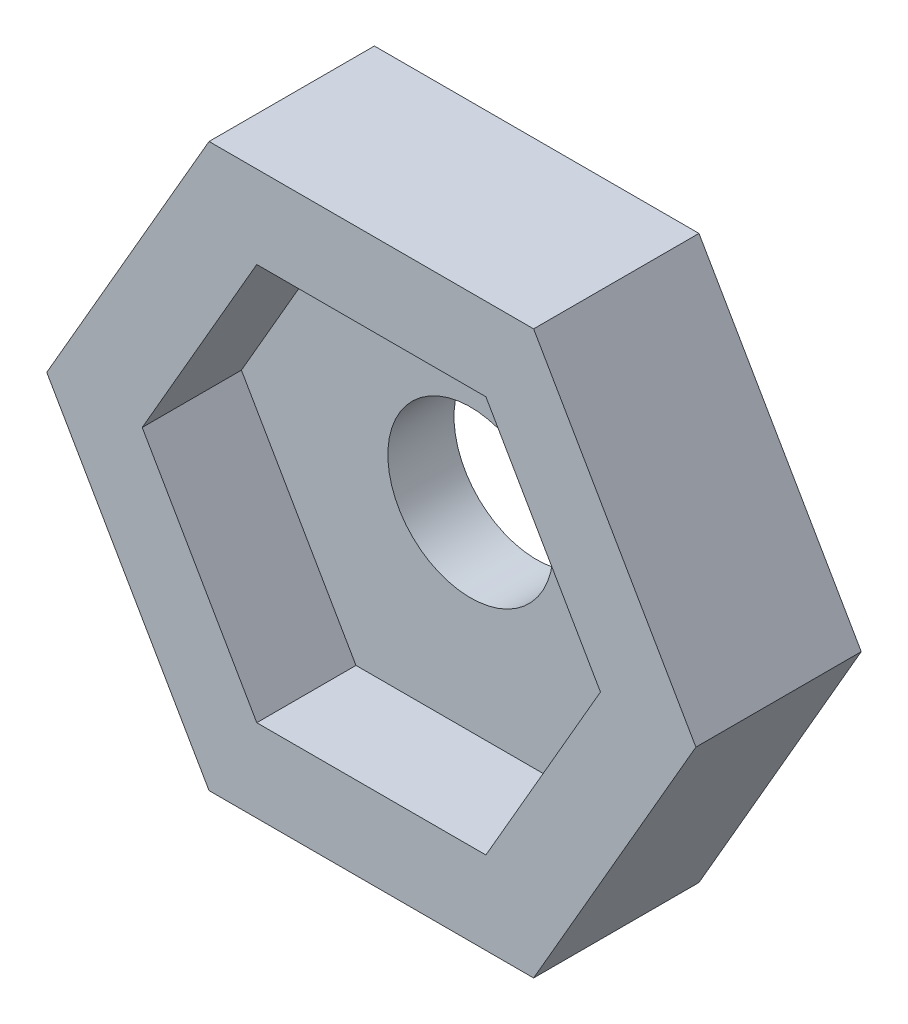
ISO-10303-21;
HEADER;
FILE_DESCRIPTION(('STEP AP214'),'2;1');
FILE_NAME('part.step','',(''),(''),'','','');
FILE_SCHEMA(('AUTOMOTIVE_DESIGN { 1 0 10303 214 1 1 1 1 }'));
ENDSEC;
DATA;
#1=APPLICATION_CONTEXT('core data for automotive mechanical design processes');
#2=APPLICATION_PROTOCOL_DEFINITION('international standard','automotive_design',2000,#1);
#3=PRODUCT_CONTEXT('',#1,'mechanical');
#4=PRODUCT('Part','Part','',(#3));
#5=PRODUCT_RELATED_PRODUCT_CATEGORY('part','',(#4));
#6=PRODUCT_DEFINITION_FORMATION('','',#4);
#7=PRODUCT_DEFINITION_CONTEXT('part definition',#1,'design');
#8=PRODUCT_DEFINITION('design','',#6,#7);
#9=PRODUCT_DEFINITION_SHAPE('','',#8);
#10=(LENGTH_UNIT() NAMED_UNIT(*) SI_UNIT(.MILLI.,.METRE.));
#11=(NAMED_UNIT(*) PLANE_ANGLE_UNIT() SI_UNIT($,.RADIAN.));
#12=(NAMED_UNIT(*) SI_UNIT($,.STERADIAN.) SOLID_ANGLE_UNIT());
#13=UNCERTAINTY_MEASURE_WITH_UNIT(LENGTH_MEASURE(1.E-05),#10,'distance_accuracy_value','');
#14=(GEOMETRIC_REPRESENTATION_CONTEXT(3) GLOBAL_UNCERTAINTY_ASSIGNED_CONTEXT((#13)) GLOBAL_UNIT_ASSIGNED_CONTEXT((#10,
#11,#12)) REPRESENTATION_CONTEXT('',''));
#15=CARTESIAN_POINT('',(0.,0.,0.));
#16=DIRECTION('',(0.,0.,1.));
#17=DIRECTION('',(1.,0.,0.));
#18=AXIS2_PLACEMENT_3D('',#15,#16,#17);
#19=CARTESIAN_POINT('',(0.,0.,5.));
#20=DIRECTION('',(0.,0.,-1.));
#21=DIRECTION('',(-1.,0.,0.));
#22=AXIS2_PLACEMENT_3D('',#19,#20,#21);
#23=CYLINDRICAL_SURFACE('',#22,2.5);
#24=CARTESIAN_POINT('',(0.,0.,0.));
#25=DIRECTION('',(0.,0.,1.));
#26=DIRECTION('',(1.,0.,0.));
#27=AXIS2_PLACEMENT_3D('',#24,#25,#26);
#28=CIRCLE('',#27,2.5);
#29=CARTESIAN_POINT('',(2.5,0.,0.));
#30=VERTEX_POINT('',#29);
#31=EDGE_CURVE('E141',#30,#30,#28,.T.);
#32=ORIENTED_EDGE('',*,*,#31,.F.);
#33=EDGE_LOOP('',(#32));
#34=FACE_BOUND('',#33,.T.);
#35=CARTESIAN_POINT('',(0.,0.,2.));
#36=DIRECTION('',(0.,0.,1.));
#37=DIRECTION('',(1.,0.,0.));
#38=AXIS2_PLACEMENT_3D('',#35,#36,#37);
#39=CIRCLE('',#38,2.5);
#40=CARTESIAN_POINT('',(2.5,0.,2.));
#41=VERTEX_POINT('',#40);
#42=EDGE_CURVE('E42',#41,#41,#39,.T.);
#43=ORIENTED_EDGE('',*,*,#42,.T.);
#44=EDGE_LOOP('',(#43));
#45=FACE_BOUND('',#44,.T.);
#46=ADVANCED_FACE('F39',(#34,#45),#23,.F.);
#47=CARTESIAN_POINT('',(-7.36121593216774,-4.25,5.));
#48=DIRECTION('',(0.866025403784439,0.5,0.));
#49=DIRECTION('',(-0.5,0.866025403784439,0.));
#50=AXIS2_PLACEMENT_3D('',#47,#48,#49);
#51=PLANE('',#50);
#52=DIRECTION('',(0.5,-0.866025403784439,0.));
#53=VECTOR('',#52,1.);
#54=CARTESIAN_POINT('',(-7.36121593216774,-4.25,0.));
#55=LINE('',#54,#53);
#56=CARTESIAN_POINT('',(-9.81495457622365,0.,0.));
#57=VERTEX_POINT('',#56);
#58=CARTESIAN_POINT('',(-4.90747728811183,-8.50000000000001,0.));
#59=VERTEX_POINT('',#58);
#60=EDGE_CURVE('E145',#57,#59,#55,.T.);
#61=ORIENTED_EDGE('',*,*,#60,.T.);
#62=DIRECTION('',(0.,0.,-1.));
#63=VECTOR('',#62,1.);
#64=CARTESIAN_POINT('',(-4.90747728811183,-8.50000000000001,5.));
#65=LINE('',#64,#63);
#66=CARTESIAN_POINT('',(-4.90747728811183,-8.50000000000001,5.));
#67=VERTEX_POINT('',#66);
#68=EDGE_CURVE('E11',#67,#59,#65,.T.);
#69=ORIENTED_EDGE('',*,*,#68,.F.);
#70=DIRECTION('',(0.5,-0.866025403784439,0.));
#71=VECTOR('',#70,1.);
#72=CARTESIAN_POINT('',(-7.36121593216774,-4.25,5.));
#73=LINE('',#72,#71);
#74=CARTESIAN_POINT('',(-9.81495457622365,0.,5.));
#75=VERTEX_POINT('',#74);
#76=EDGE_CURVE('E162',#75,#67,#73,.T.);
#77=ORIENTED_EDGE('',*,*,#76,.F.);
#78=DIRECTION('',(0.,0.,-1.));
#79=VECTOR('',#78,1.);
#80=CARTESIAN_POINT('',(-9.81495457622365,0.,5.));
#81=LINE('',#80,#79);
#82=EDGE_CURVE('E137',#75,#57,#81,.T.);
#83=ORIENTED_EDGE('',*,*,#82,.T.);
#84=EDGE_LOOP('',(#61,#69,#77,#83));
#85=FACE_BOUND('',#84,.T.);
#86=ADVANCED_FACE('F181',(#85),#51,.F.);
#87=CARTESIAN_POINT('',(0.,-8.50000000000001,5.));
#88=DIRECTION('',(0.,1.,0.));
#89=DIRECTION('',(-1.,0.,0.));
#90=AXIS2_PLACEMENT_3D('',#87,#88,#89);
#91=PLANE('',#90);
#92=DIRECTION('',(1.,0.,0.));
#93=VECTOR('',#92,1.);
#94=CARTESIAN_POINT('',(0.,-8.50000000000001,0.));
#95=LINE('',#94,#93);
#96=CARTESIAN_POINT('',(4.90747728811182,-8.50000000000001,0.));
#97=VERTEX_POINT('',#96);
#98=EDGE_CURVE('E149',#59,#97,#95,.T.);
#99=ORIENTED_EDGE('',*,*,#98,.T.);
#100=DIRECTION('',(0.,0.,-1.));
#101=VECTOR('',#100,1.);
#102=CARTESIAN_POINT('',(4.90747728811182,-8.50000000000001,5.));
#103=LINE('',#102,#101);
#104=CARTESIAN_POINT('',(4.90747728811182,-8.50000000000001,5.));
#105=VERTEX_POINT('',#104);
#106=EDGE_CURVE('E48',#105,#97,#103,.T.);
#107=ORIENTED_EDGE('',*,*,#106,.F.);
#108=DIRECTION('',(1.,0.,0.));
#109=VECTOR('',#108,1.);
#110=CARTESIAN_POINT('',(0.,-8.50000000000001,5.));
#111=LINE('',#110,#109);
#112=EDGE_CURVE('E99',#67,#105,#111,.T.);
#113=ORIENTED_EDGE('',*,*,#112,.F.);
#114=ORIENTED_EDGE('',*,*,#68,.T.);
#115=EDGE_LOOP('',(#99,#107,#113,#114));
#116=FACE_BOUND('',#115,.T.);
#117=ADVANCED_FACE('F316',(#116),#91,.F.);
#118=CARTESIAN_POINT('',(7.36121593216773,-4.25000000000001,5.));
#119=DIRECTION('',(-0.866025403784438,0.500000000000001,0.));
#120=DIRECTION('',(-0.500000000000001,-0.866025403784438,0.));
#121=AXIS2_PLACEMENT_3D('',#118,#119,#120);
#122=PLANE('',#121);
#123=DIRECTION('',(0.500000000000001,0.866025403784438,0.));
#124=VECTOR('',#123,1.);
#125=CARTESIAN_POINT('',(7.36121593216773,-4.25000000000001,0.));
#126=LINE('',#125,#124);
#127=CARTESIAN_POINT('',(9.81495457622365,0.,0.));
#128=VERTEX_POINT('',#127);
#129=EDGE_CURVE('E152',#97,#128,#126,.T.);
#130=ORIENTED_EDGE('',*,*,#129,.T.);
#131=DIRECTION('',(0.,0.,-1.));
#132=VECTOR('',#131,1.);
#133=CARTESIAN_POINT('',(9.81495457622365,0.,5.));
#134=LINE('',#133,#132);
#135=CARTESIAN_POINT('',(9.81495457622365,0.,5.));
#136=VERTEX_POINT('',#135);
#137=EDGE_CURVE('E130',#136,#128,#134,.T.);
#138=ORIENTED_EDGE('',*,*,#137,.F.);
#139=DIRECTION('',(0.500000000000001,0.866025403784438,0.));
#140=VECTOR('',#139,1.);
#141=CARTESIAN_POINT('',(7.36121593216773,-4.25000000000001,5.));
#142=LINE('',#141,#140);
#143=EDGE_CURVE('E116',#105,#136,#142,.T.);
#144=ORIENTED_EDGE('',*,*,#143,.F.);
#145=ORIENTED_EDGE('',*,*,#106,.T.);
#146=EDGE_LOOP('',(#130,#138,#144,#145));
#147=FACE_BOUND('',#146,.T.);
#148=ADVANCED_FACE('F173',(#147),#122,.F.);
#149=CARTESIAN_POINT('',(7.36121593216774,4.25,5.));
#150=DIRECTION('',(-0.866025403784439,-0.5,0.));
#151=DIRECTION('',(0.5,-0.866025403784439,0.));
#152=AXIS2_PLACEMENT_3D('',#149,#150,#151);
#153=PLANE('',#152);
#154=DIRECTION('',(-0.5,0.866025403784439,0.));
#155=VECTOR('',#154,1.);
#156=CARTESIAN_POINT('',(7.36121593216774,4.25,0.));
#157=LINE('',#156,#155);
#158=CARTESIAN_POINT('',(4.90747728811183,8.5,0.));
#159=VERTEX_POINT('',#158);
#160=EDGE_CURVE('E126',#128,#159,#157,.T.);
#161=ORIENTED_EDGE('',*,*,#160,.T.);
#162=DIRECTION('',(0.,0.,-1.));
#163=VECTOR('',#162,1.);
#164=CARTESIAN_POINT('',(4.90747728811183,8.5,5.));
#165=LINE('',#164,#163);
#166=CARTESIAN_POINT('',(4.90747728811183,8.5,5.));
#167=VERTEX_POINT('',#166);
#168=EDGE_CURVE('E123',#167,#159,#165,.T.);
#169=ORIENTED_EDGE('',*,*,#168,.F.);
#170=DIRECTION('',(-0.5,0.866025403784439,0.));
#171=VECTOR('',#170,1.);
#172=CARTESIAN_POINT('',(7.36121593216774,4.25,5.));
#173=LINE('',#172,#171);
#174=EDGE_CURVE('E109',#136,#167,#173,.T.);
#175=ORIENTED_EDGE('',*,*,#174,.F.);
#176=ORIENTED_EDGE('',*,*,#137,.T.);
#177=EDGE_LOOP('',(#161,#169,#175,#176));
#178=FACE_BOUND('',#177,.T.);
#179=ADVANCED_FACE('F124',(#178),#153,.F.);
#180=CARTESIAN_POINT('',(0.,8.50000000000001,5.));
#181=DIRECTION('',(0.,-1.,0.));
#182=DIRECTION('',(1.,0.,0.));
#183=AXIS2_PLACEMENT_3D('',#180,#181,#182);
#184=PLANE('',#183);
#185=DIRECTION('',(-1.,0.,0.));
#186=VECTOR('',#185,1.);
#187=CARTESIAN_POINT('',(0.,8.50000000000001,0.));
#188=LINE('',#187,#186);
#189=CARTESIAN_POINT('',(-4.90747728811182,8.50000000000001,0.));
#190=VERTEX_POINT('',#189);
#191=EDGE_CURVE('E157',#159,#190,#188,.T.);
#192=ORIENTED_EDGE('',*,*,#191,.T.);
#193=DIRECTION('',(0.,0.,-1.));
#194=VECTOR('',#193,1.);
#195=CARTESIAN_POINT('',(-4.90747728811182,8.50000000000001,5.));
#196=LINE('',#195,#194);
#197=CARTESIAN_POINT('',(-4.90747728811182,8.50000000000001,5.));
#198=VERTEX_POINT('',#197);
#199=EDGE_CURVE('E131',#198,#190,#196,.T.);
#200=ORIENTED_EDGE('',*,*,#199,.F.);
#201=DIRECTION('',(-1.,0.,0.));
#202=VECTOR('',#201,1.);
#203=CARTESIAN_POINT('',(0.,8.50000000000001,5.));
#204=LINE('',#203,#202);
#205=EDGE_CURVE('E113',#167,#198,#204,.T.);
#206=ORIENTED_EDGE('',*,*,#205,.F.);
#207=ORIENTED_EDGE('',*,*,#168,.T.);
#208=EDGE_LOOP('',(#192,#200,#206,#207));
#209=FACE_BOUND('',#208,.T.);
#210=ADVANCED_FACE('F133',(#209),#184,.F.);
#211=CARTESIAN_POINT('',(-7.36121593216773,4.25000000000001,5.));
#212=DIRECTION('',(0.866025403784438,-0.5,0.));
#213=DIRECTION('',(0.5,0.866025403784438,0.));
#214=AXIS2_PLACEMENT_3D('',#211,#212,#213);
#215=PLANE('',#214);
#216=DIRECTION('',(-0.5,-0.866025403784438,0.));
#217=VECTOR('',#216,1.);
#218=CARTESIAN_POINT('',(-7.36121593216773,4.25000000000001,0.));
#219=LINE('',#218,#217);
#220=EDGE_CURVE('E91',#190,#57,#219,.T.);
#221=ORIENTED_EDGE('',*,*,#220,.T.);
#222=ORIENTED_EDGE('',*,*,#82,.F.);
#223=DIRECTION('',(-0.5,-0.866025403784438,0.));
#224=VECTOR('',#223,1.);
#225=CARTESIAN_POINT('',(-7.36121593216773,4.25000000000001,5.));
#226=LINE('',#225,#224);
#227=EDGE_CURVE('E64',#198,#75,#226,.T.);
#228=ORIENTED_EDGE('',*,*,#227,.F.);
#229=ORIENTED_EDGE('',*,*,#199,.T.);
#230=EDGE_LOOP('',(#221,#222,#228,#229));
#231=FACE_BOUND('',#230,.T.);
#232=ADVANCED_FACE('F177',(#231),#215,.F.);
#233=CARTESIAN_POINT('',(0.,0.,5.));
#234=DIRECTION('',(0.,0.,1.));
#235=DIRECTION('',(1.,0.,0.));
#236=AXIS2_PLACEMENT_3D('',#233,#234,#235);
#237=PLANE('',#236);
#238=DIRECTION('',(1.,0.,0.));
#239=VECTOR('',#238,1.);
#240=CARTESIAN_POINT('',(-3.46410161513775,-6.,5.));
#241=LINE('',#240,#239);
#242=CARTESIAN_POINT('',(-3.46410161513775,-6.,5.));
#243=VERTEX_POINT('',#242);
#244=CARTESIAN_POINT('',(3.46410161513776,-6.,5.));
#245=VERTEX_POINT('',#244);
#246=EDGE_CURVE('E55',#243,#245,#241,.T.);
#247=ORIENTED_EDGE('',*,*,#246,.F.);
#248=DIRECTION('',(0.5,-0.866025403784438,0.));
#249=VECTOR('',#248,1.);
#250=CARTESIAN_POINT('',(-6.92820323027551,0.,5.));
#251=LINE('',#250,#249);
#252=CARTESIAN_POINT('',(-6.92820323027551,0.,5.));
#253=VERTEX_POINT('',#252);
#254=EDGE_CURVE('E211',#253,#243,#251,.T.);
#255=ORIENTED_EDGE('',*,*,#254,.F.);
#256=DIRECTION('',(-0.5,-0.866025403784439,0.));
#257=VECTOR('',#256,1.);
#258=CARTESIAN_POINT('',(-3.46410161513776,6.,5.));
#259=LINE('',#258,#257);
#260=CARTESIAN_POINT('',(-3.46410161513776,6.,5.));
#261=VERTEX_POINT('',#260);
#262=EDGE_CURVE('E216',#261,#253,#259,.T.);
#263=ORIENTED_EDGE('',*,*,#262,.F.);
#264=DIRECTION('',(-1.,0.,0.));
#265=VECTOR('',#264,1.);
#266=CARTESIAN_POINT('',(3.46410161513776,6.,5.));
#267=LINE('',#266,#265);
#268=CARTESIAN_POINT('',(3.46410161513776,6.,5.));
#269=VERTEX_POINT('',#268);
#270=EDGE_CURVE('E220',#269,#261,#267,.T.);
#271=ORIENTED_EDGE('',*,*,#270,.F.);
#272=DIRECTION('',(-0.500000000000001,0.866025403784438,0.));
#273=VECTOR('',#272,1.);
#274=CARTESIAN_POINT('',(6.92820323027551,0.,5.));
#275=LINE('',#274,#273);
#276=CARTESIAN_POINT('',(6.92820323027551,0.,5.));
#277=VERTEX_POINT('',#276);
#278=EDGE_CURVE('E224',#277,#269,#275,.T.);
#279=ORIENTED_EDGE('',*,*,#278,.F.);
#280=DIRECTION('',(0.5,0.866025403784439,0.));
#281=VECTOR('',#280,1.);
#282=CARTESIAN_POINT('',(3.46410161513776,-6.,5.));
#283=LINE('',#282,#281);
#284=EDGE_CURVE('E228',#245,#277,#283,.T.);
#285=ORIENTED_EDGE('',*,*,#284,.F.);
#286=EDGE_LOOP('',(#247,#255,#263,#271,#279,#285));
#287=FACE_BOUND('',#286,.T.);
#288=ORIENTED_EDGE('',*,*,#76,.T.);
#289=ORIENTED_EDGE('',*,*,#112,.T.);
#290=ORIENTED_EDGE('',*,*,#143,.T.);
#291=ORIENTED_EDGE('',*,*,#174,.T.);
#292=ORIENTED_EDGE('',*,*,#205,.T.);
#293=ORIENTED_EDGE('',*,*,#227,.T.);
#294=EDGE_LOOP('',(#288,#289,#290,#291,#292,#293));
#295=FACE_BOUND('',#294,.T.);
#296=ADVANCED_FACE('F111',(#287,#295),#237,.T.);
#297=CARTESIAN_POINT('',(0.,0.,0.));
#298=DIRECTION('',(0.,0.,1.));
#299=DIRECTION('',(1.,0.,0.));
#300=AXIS2_PLACEMENT_3D('',#297,#298,#299);
#301=PLANE('',#300);
#302=ORIENTED_EDGE('',*,*,#31,.T.);
#303=EDGE_LOOP('',(#302));
#304=FACE_BOUND('',#303,.T.);
#305=ORIENTED_EDGE('',*,*,#60,.F.);
#306=ORIENTED_EDGE('',*,*,#220,.F.);
#307=ORIENTED_EDGE('',*,*,#191,.F.);
#308=ORIENTED_EDGE('',*,*,#160,.F.);
#309=ORIENTED_EDGE('',*,*,#129,.F.);
#310=ORIENTED_EDGE('',*,*,#98,.F.);
#311=EDGE_LOOP('',(#305,#306,#307,#308,#309,#310));
#312=FACE_BOUND('',#311,.T.);
#313=ADVANCED_FACE('F176',(#304,#312),#301,.F.);
#314=CARTESIAN_POINT('',(-3.46410161513775,-6.,2.));
#315=DIRECTION('',(0.,-1.,0.));
#316=DIRECTION('',(1.,0.,0.));
#317=AXIS2_PLACEMENT_3D('',#314,#315,#316);
#318=PLANE('',#317);
#319=ORIENTED_EDGE('',*,*,#246,.T.);
#320=DIRECTION('',(0.,0.,1.));
#321=VECTOR('',#320,1.);
#322=CARTESIAN_POINT('',(3.46410161513776,-6.,2.));
#323=LINE('',#322,#321);
#324=CARTESIAN_POINT('',(3.46410161513776,-6.,2.));
#325=VERTEX_POINT('',#324);
#326=EDGE_CURVE('E187',#325,#245,#323,.T.);
#327=ORIENTED_EDGE('',*,*,#326,.F.);
#328=DIRECTION('',(1.,0.,0.));
#329=VECTOR('',#328,1.);
#330=CARTESIAN_POINT('',(-3.46410161513775,-6.,2.));
#331=LINE('',#330,#329);
#332=CARTESIAN_POINT('',(-3.46410161513775,-6.,2.));
#333=VERTEX_POINT('',#332);
#334=EDGE_CURVE('E215',#333,#325,#331,.T.);
#335=ORIENTED_EDGE('',*,*,#334,.F.);
#336=DIRECTION('',(0.,0.,1.));
#337=VECTOR('',#336,1.);
#338=CARTESIAN_POINT('',(-3.46410161513775,-6.,2.));
#339=LINE('',#338,#337);
#340=EDGE_CURVE('E208',#333,#243,#339,.T.);
#341=ORIENTED_EDGE('',*,*,#340,.T.);
#342=EDGE_LOOP('',(#319,#327,#335,#341));
#343=FACE_BOUND('',#342,.T.);
#344=ADVANCED_FACE('F263',(#343),#318,.F.);
#345=CARTESIAN_POINT('',(-6.92820323027551,0.,2.));
#346=DIRECTION('',(-0.866025403784439,-0.5,0.));
#347=DIRECTION('',(0.5,-0.866025403784439,0.));
#348=AXIS2_PLACEMENT_3D('',#345,#346,#347);
#349=PLANE('',#348);
#350=ORIENTED_EDGE('',*,*,#254,.T.);
#351=ORIENTED_EDGE('',*,*,#340,.F.);
#352=DIRECTION('',(0.5,-0.866025403784438,0.));
#353=VECTOR('',#352,1.);
#354=CARTESIAN_POINT('',(-6.92820323027551,0.,2.));
#355=LINE('',#354,#353);
#356=CARTESIAN_POINT('',(-6.92820323027551,0.,2.));
#357=VERTEX_POINT('',#356);
#358=EDGE_CURVE('E192',#357,#333,#355,.T.);
#359=ORIENTED_EDGE('',*,*,#358,.F.);
#360=DIRECTION('',(0.,0.,1.));
#361=VECTOR('',#360,1.);
#362=CARTESIAN_POINT('',(-6.92820323027551,0.,2.));
#363=LINE('',#362,#361);
#364=EDGE_CURVE('E204',#357,#253,#363,.T.);
#365=ORIENTED_EDGE('',*,*,#364,.T.);
#366=EDGE_LOOP('',(#350,#351,#359,#365));
#367=FACE_BOUND('',#366,.T.);
#368=ADVANCED_FACE('F279',(#367),#349,.F.);
#369=CARTESIAN_POINT('',(-3.46410161513776,6.,2.));
#370=DIRECTION('',(-0.866025403784438,0.5,0.));
#371=DIRECTION('',(-0.5,-0.866025403784439,0.));
#372=AXIS2_PLACEMENT_3D('',#369,#370,#371);
#373=PLANE('',#372);
#374=ORIENTED_EDGE('',*,*,#262,.T.);
#375=ORIENTED_EDGE('',*,*,#364,.F.);
#376=DIRECTION('',(-0.5,-0.866025403784439,0.));
#377=VECTOR('',#376,1.);
#378=CARTESIAN_POINT('',(-3.46410161513776,6.,2.));
#379=LINE('',#378,#377);
#380=CARTESIAN_POINT('',(-3.46410161513776,6.,2.));
#381=VERTEX_POINT('',#380);
#382=EDGE_CURVE('E237',#381,#357,#379,.T.);
#383=ORIENTED_EDGE('',*,*,#382,.F.);
#384=DIRECTION('',(0.,0.,1.));
#385=VECTOR('',#384,1.);
#386=CARTESIAN_POINT('',(-3.46410161513776,6.,2.));
#387=LINE('',#386,#385);
#388=EDGE_CURVE('E200',#381,#261,#387,.T.);
#389=ORIENTED_EDGE('',*,*,#388,.T.);
#390=EDGE_LOOP('',(#374,#375,#383,#389));
#391=FACE_BOUND('',#390,.T.);
#392=ADVANCED_FACE('F284',(#391),#373,.F.);
#393=CARTESIAN_POINT('',(3.46410161513776,6.,2.));
#394=DIRECTION('',(0.,1.,0.));
#395=DIRECTION('',(-1.,0.,0.));
#396=AXIS2_PLACEMENT_3D('',#393,#394,#395);
#397=PLANE('',#396);
#398=ORIENTED_EDGE('',*,*,#270,.T.);
#399=ORIENTED_EDGE('',*,*,#388,.F.);
#400=DIRECTION('',(-1.,0.,0.));
#401=VECTOR('',#400,1.);
#402=CARTESIAN_POINT('',(3.46410161513776,6.,2.));
#403=LINE('',#402,#401);
#404=CARTESIAN_POINT('',(3.46410161513776,6.,2.));
#405=VERTEX_POINT('',#404);
#406=EDGE_CURVE('E241',#405,#381,#403,.T.);
#407=ORIENTED_EDGE('',*,*,#406,.F.);
#408=DIRECTION('',(0.,0.,1.));
#409=VECTOR('',#408,1.);
#410=CARTESIAN_POINT('',(3.46410161513776,6.,2.));
#411=LINE('',#410,#409);
#412=EDGE_CURVE('E196',#405,#269,#411,.T.);
#413=ORIENTED_EDGE('',*,*,#412,.T.);
#414=EDGE_LOOP('',(#398,#399,#407,#413));
#415=FACE_BOUND('',#414,.T.);
#416=ADVANCED_FACE('F302',(#415),#397,.F.);
#417=CARTESIAN_POINT('',(6.92820323027551,0.,2.));
#418=DIRECTION('',(0.866025403784438,0.500000000000001,0.));
#419=DIRECTION('',(-0.500000000000001,0.866025403784438,0.));
#420=AXIS2_PLACEMENT_3D('',#417,#418,#419);
#421=PLANE('',#420);
#422=ORIENTED_EDGE('',*,*,#278,.T.);
#423=ORIENTED_EDGE('',*,*,#412,.F.);
#424=DIRECTION('',(-0.500000000000001,0.866025403784438,0.));
#425=VECTOR('',#424,1.);
#426=CARTESIAN_POINT('',(6.92820323027551,0.,2.));
#427=LINE('',#426,#425);
#428=CARTESIAN_POINT('',(6.92820323027551,0.,2.));
#429=VERTEX_POINT('',#428);
#430=EDGE_CURVE('E245',#429,#405,#427,.T.);
#431=ORIENTED_EDGE('',*,*,#430,.F.);
#432=DIRECTION('',(0.,0.,1.));
#433=VECTOR('',#432,1.);
#434=CARTESIAN_POINT('',(6.92820323027551,0.,2.));
#435=LINE('',#434,#433);
#436=EDGE_CURVE('E191',#429,#277,#435,.T.);
#437=ORIENTED_EDGE('',*,*,#436,.T.);
#438=EDGE_LOOP('',(#422,#423,#431,#437));
#439=FACE_BOUND('',#438,.T.);
#440=ADVANCED_FACE('F298',(#439),#421,.F.);
#441=CARTESIAN_POINT('',(3.46410161513776,-6.,2.));
#442=DIRECTION('',(0.866025403784439,-0.5,0.));
#443=DIRECTION('',(0.5,0.866025403784439,0.));
#444=AXIS2_PLACEMENT_3D('',#441,#442,#443);
#445=PLANE('',#444);
#446=ORIENTED_EDGE('',*,*,#284,.T.);
#447=ORIENTED_EDGE('',*,*,#436,.F.);
#448=DIRECTION('',(0.5,0.866025403784439,0.));
#449=VECTOR('',#448,1.);
#450=CARTESIAN_POINT('',(3.46410161513776,-6.,2.));
#451=LINE('',#450,#449);
#452=EDGE_CURVE('E249',#325,#429,#451,.T.);
#453=ORIENTED_EDGE('',*,*,#452,.F.);
#454=ORIENTED_EDGE('',*,*,#326,.T.);
#455=EDGE_LOOP('',(#446,#447,#453,#454));
#456=FACE_BOUND('',#455,.T.);
#457=ADVANCED_FACE('F292',(#456),#445,.F.);
#458=CARTESIAN_POINT('',(0.,0.,2.));
#459=DIRECTION('',(0.,0.,1.));
#460=DIRECTION('',(1.,0.,0.));
#461=AXIS2_PLACEMENT_3D('',#458,#459,#460);
#462=PLANE('',#461);
#463=ORIENTED_EDGE('',*,*,#42,.F.);
#464=EDGE_LOOP('',(#463));
#465=FACE_BOUND('',#464,.T.);
#466=ORIENTED_EDGE('',*,*,#334,.T.);
#467=ORIENTED_EDGE('',*,*,#452,.T.);
#468=ORIENTED_EDGE('',*,*,#430,.T.);
#469=ORIENTED_EDGE('',*,*,#406,.T.);
#470=ORIENTED_EDGE('',*,*,#382,.T.);
#471=ORIENTED_EDGE('',*,*,#358,.T.);
#472=EDGE_LOOP('',(#466,#467,#468,#469,#470,#471));
#473=FACE_BOUND('',#472,.T.);
#474=ADVANCED_FACE('F258',(#465,#473),#462,.T.);
#475=CLOSED_SHELL('',(#46,#86,#117,#148,#179,#210,#232,#296,#313,#344,#368,#392,#416,#440,#457,#474));
#476=MANIFOLD_SOLID_BREP('B2',#475);
#477=ADVANCED_BREP_SHAPE_REPRESENTATION('',(#18,#476),#14);
#478=SHAPE_DEFINITION_REPRESENTATION(#9,#477);
ENDSEC;
END-ISO-10303-21;
